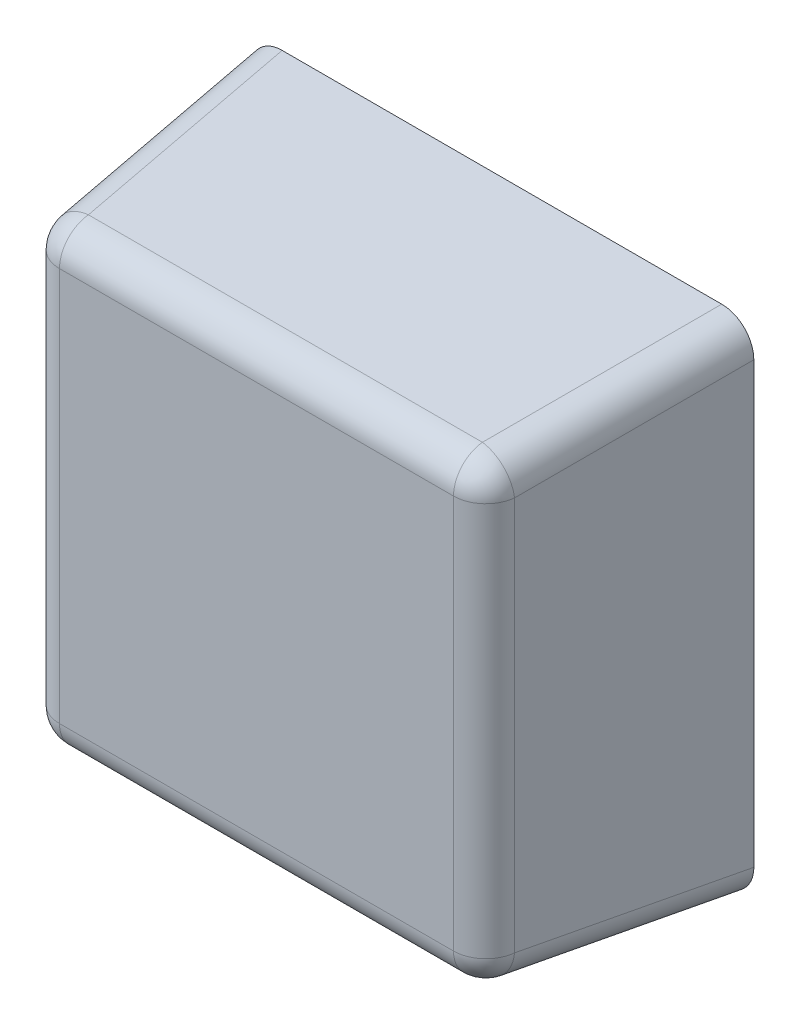
ISO-10303-21;
HEADER;
FILE_DESCRIPTION(('STEP AP214'),'2;1');
FILE_NAME('part.step','',(''),(''),'','','');
FILE_SCHEMA(('AUTOMOTIVE_DESIGN { 1 0 10303 214 1 1 1 1 }'));
ENDSEC;
DATA;
#1=APPLICATION_CONTEXT('core data for automotive mechanical design processes');
#2=APPLICATION_PROTOCOL_DEFINITION('international standard','automotive_design',2000,#1);
#3=PRODUCT_CONTEXT('',#1,'mechanical');
#4=PRODUCT('Part','Part','',(#3));
#5=PRODUCT_RELATED_PRODUCT_CATEGORY('part','',(#4));
#6=PRODUCT_DEFINITION_FORMATION('','',#4);
#7=PRODUCT_DEFINITION_CONTEXT('part definition',#1,'design');
#8=PRODUCT_DEFINITION('design','',#6,#7);
#9=PRODUCT_DEFINITION_SHAPE('','',#8);
#10=(LENGTH_UNIT() NAMED_UNIT(*) SI_UNIT(.MILLI.,.METRE.));
#11=(NAMED_UNIT(*) PLANE_ANGLE_UNIT() SI_UNIT($,.RADIAN.));
#12=(NAMED_UNIT(*) SI_UNIT($,.STERADIAN.) SOLID_ANGLE_UNIT());
#13=UNCERTAINTY_MEASURE_WITH_UNIT(LENGTH_MEASURE(1.E-05),#10,'distance_accuracy_value','');
#14=(GEOMETRIC_REPRESENTATION_CONTEXT(3) GLOBAL_UNCERTAINTY_ASSIGNED_CONTEXT((#13)) GLOBAL_UNIT_ASSIGNED_CONTEXT((#10,
#11,#12)) REPRESENTATION_CONTEXT('',''));
#15=CARTESIAN_POINT('',(0.,0.,0.));
#16=DIRECTION('',(0.,0.,1.));
#17=DIRECTION('',(1.,0.,0.));
#18=AXIS2_PLACEMENT_3D('',#15,#16,#17);
#19=CARTESIAN_POINT('',(0.,0.,0.));
#20=DIRECTION('',(-0.994521895368273,0.,0.104528463267653));
#21=DIRECTION('',(0.104528463267653,0.,0.994521895368273));
#22=AXIS2_PLACEMENT_3D('',#19,#20,#21);
#23=PLANE('',#22);
#24=DIRECTION('',(0.,-1.,0.));
#25=VECTOR('',#24,1.);
#26=CARTESIAN_POINT('',(0.,0.,0.));
#27=LINE('',#26,#25);
#28=CARTESIAN_POINT('',(0.,-1.26304280711771,0.));
#29=VERTEX_POINT('',#28);
#30=CARTESIAN_POINT('',(0.,-18.5489571928823,0.));
#31=VERTEX_POINT('',#30);
#32=EDGE_CURVE('E198',#29,#31,#27,.T.);
#33=ORIENTED_EDGE('',*,*,#32,.T.);
#34=DIRECTION('',(0.103962051184498,0.103962051184498,0.989132844377854));
#35=VECTOR('',#34,1.);
#36=CARTESIAN_POINT('',(0.200479134232315,-18.34847805865,1.90743154855324));
#37=LINE('',#36,#35);
#38=CARTESIAN_POINT('',(0.894936407924861,-17.6540207849574,8.51475114834992));
#39=VERTEX_POINT('',#38);
#40=EDGE_CURVE('E50',#31,#39,#37,.T.);
#41=ORIENTED_EDGE('',*,*,#40,.T.);
#42=DIRECTION('',(0.,-1.,0.));
#43=VECTOR('',#42,1.);
#44=CARTESIAN_POINT('',(0.894936407924859,-1.01446607878431,8.51475114834992));
#45=LINE('',#44,#43);
#46=CARTESIAN_POINT('',(0.894936407924859,-2.15797921504257,8.51475114834992));
#47=VERTEX_POINT('',#46);
#48=EDGE_CURVE('E55',#39,#47,#45,.F.);
#49=ORIENTED_EDGE('',*,*,#48,.T.);
#50=DIRECTION('',(0.103962051184498,-0.103962051184498,0.989132844377854));
#51=VECTOR('',#50,1.);
#52=CARTESIAN_POINT('',(-0.0136511031771894,-1.24939170394052,-0.129881570829977));
#53=LINE('',#52,#51);
#54=EDGE_CURVE('E167',#47,#29,#53,.F.);
#55=ORIENTED_EDGE('',*,*,#54,.T.);
#56=EDGE_LOOP('',(#33,#41,#49,#55));
#57=FACE_BOUND('',#56,.T.);
#58=ADVANCED_FACE('F33',(#57),#23,.T.);
#59=CARTESIAN_POINT('',(0.,-19.812,0.));
#60=DIRECTION('',(0.,-0.994521895368273,0.104528463267653));
#61=DIRECTION('',(0.,-0.104528463267653,-0.994521895368273));
#62=AXIS2_PLACEMENT_3D('',#59,#60,#61);
#63=PLANE('',#62);
#64=DIRECTION('',(1.,0.,0.));
#65=VECTOR('',#64,1.);
#66=CARTESIAN_POINT('',(0.,-19.812,0.));
#67=LINE('',#66,#65);
#68=CARTESIAN_POINT('',(1.26304280711771,-19.812,0.));
#69=VERTEX_POINT('',#68);
#70=CARTESIAN_POINT('',(18.5489571928823,-19.812,0.));
#71=VERTEX_POINT('',#70);
#72=EDGE_CURVE('E200',#69,#71,#67,.T.);
#73=ORIENTED_EDGE('',*,*,#72,.T.);
#74=DIRECTION('',(-0.103962051184498,0.103962051184498,0.989132844377854));
#75=VECTOR('',#74,1.);
#76=CARTESIAN_POINT('',(18.34847805865,-19.6115208657677,1.90743154855324));
#77=LINE('',#76,#75);
#78=CARTESIAN_POINT('',(17.6540207849574,-18.9170635920751,8.51475114834992));
#79=VERTEX_POINT('',#78);
#80=EDGE_CURVE('E165',#71,#79,#77,.T.);
#81=ORIENTED_EDGE('',*,*,#80,.T.);
#82=DIRECTION('',(1.,0.,0.));
#83=VECTOR('',#82,1.);
#84=CARTESIAN_POINT('',(1.01446607878431,-18.9170635920751,8.51475114834992));
#85=LINE('',#84,#83);
#86=CARTESIAN_POINT('',(2.15797921504257,-18.9170635920751,8.51475114834992));
#87=VERTEX_POINT('',#86);
#88=EDGE_CURVE('E163',#79,#87,#85,.F.);
#89=ORIENTED_EDGE('',*,*,#88,.T.);
#90=DIRECTION('',(0.103962051184498,0.103962051184498,0.989132844377854));
#91=VECTOR('',#90,1.);
#92=CARTESIAN_POINT('',(1.24939170394052,-19.8256511031772,-0.129881570829977));
#93=LINE('',#92,#91);
#94=EDGE_CURVE('E161',#87,#69,#93,.F.);
#95=ORIENTED_EDGE('',*,*,#94,.T.);
#96=EDGE_LOOP('',(#73,#81,#89,#95));
#97=FACE_BOUND('',#96,.T.);
#98=ADVANCED_FACE('F253',(#97),#63,.T.);
#99=CARTESIAN_POINT('',(19.812,0.,0.));
#100=DIRECTION('',(0.994521895368273,0.,0.104528463267653));
#101=DIRECTION('',(0.104528463267653,0.,-0.994521895368273));
#102=AXIS2_PLACEMENT_3D('',#99,#100,#101);
#103=PLANE('',#102);
#104=DIRECTION('',(0.,1.,0.));
#105=VECTOR('',#104,1.);
#106=CARTESIAN_POINT('',(18.9170635920751,-18.7975339212157,8.51475114834992));
#107=LINE('',#106,#105);
#108=CARTESIAN_POINT('',(18.9170635920751,-2.15797921504257,8.51475114834992));
#109=VERTEX_POINT('',#108);
#110=CARTESIAN_POINT('',(18.9170635920751,-17.6540207849574,8.51475114834992));
#111=VERTEX_POINT('',#110);
#112=EDGE_CURVE('E157',#109,#111,#107,.F.);
#113=ORIENTED_EDGE('',*,*,#112,.T.);
#114=DIRECTION('',(-0.103962051184498,0.103962051184498,0.989132844377854));
#115=VECTOR('',#114,1.);
#116=CARTESIAN_POINT('',(19.6115208657677,-18.34847805865,1.90743154855324));
#117=LINE('',#116,#115);
#118=CARTESIAN_POINT('',(19.812,-18.5489571928823,0.));
#119=VERTEX_POINT('',#118);
#120=EDGE_CURVE('E159',#111,#119,#117,.F.);
#121=ORIENTED_EDGE('',*,*,#120,.T.);
#122=DIRECTION('',(0.,1.,0.));
#123=VECTOR('',#122,1.);
#124=CARTESIAN_POINT('',(19.812,0.,0.));
#125=LINE('',#124,#123);
#126=CARTESIAN_POINT('',(19.812,-1.26304280711771,0.));
#127=VERTEX_POINT('',#126);
#128=EDGE_CURVE('E204',#119,#127,#125,.T.);
#129=ORIENTED_EDGE('',*,*,#128,.T.);
#130=DIRECTION('',(-0.103962051184498,-0.103962051184498,0.989132844377854));
#131=VECTOR('',#130,1.);
#132=CARTESIAN_POINT('',(19.8256511031772,-1.24939170394052,-0.129881570829977));
#133=LINE('',#132,#131);
#134=EDGE_CURVE('E155',#127,#109,#133,.T.);
#135=ORIENTED_EDGE('',*,*,#134,.T.);
#136=EDGE_LOOP('',(#113,#121,#129,#135));
#137=FACE_BOUND('',#136,.T.);
#138=ADVANCED_FACE('F258',(#137),#103,.T.);
#139=CARTESIAN_POINT('',(0.,0.,0.));
#140=DIRECTION('',(0.,0.994521895368273,0.104528463267653));
#141=DIRECTION('',(0.,-0.104528463267653,0.994521895368273));
#142=AXIS2_PLACEMENT_3D('',#139,#140,#141);
#143=PLANE('',#142);
#144=DIRECTION('',(-1.,0.,0.));
#145=VECTOR('',#144,1.);
#146=CARTESIAN_POINT('',(0.,0.,0.));
#147=LINE('',#146,#145);
#148=CARTESIAN_POINT('',(18.5489571928823,0.,0.));
#149=VERTEX_POINT('',#148);
#150=CARTESIAN_POINT('',(1.26304280711771,0.,0.));
#151=VERTEX_POINT('',#150);
#152=EDGE_CURVE('E140',#149,#151,#147,.T.);
#153=ORIENTED_EDGE('',*,*,#152,.T.);
#154=DIRECTION('',(0.103962051184498,-0.103962051184498,0.989132844377854));
#155=VECTOR('',#154,1.);
#156=CARTESIAN_POINT('',(1.24939170394052,0.0136511031771896,-0.129881570829977));
#157=LINE('',#156,#155);
#158=CARTESIAN_POINT('',(2.15797921504257,-0.894936407924859,8.51475114834992));
#159=VERTEX_POINT('',#158);
#160=EDGE_CURVE('E153',#151,#159,#157,.T.);
#161=ORIENTED_EDGE('',*,*,#160,.T.);
#162=DIRECTION('',(-1.,0.,0.));
#163=VECTOR('',#162,1.);
#164=CARTESIAN_POINT('',(18.7975339212157,-0.894936407924859,8.51475114834992));
#165=LINE('',#164,#163);
#166=CARTESIAN_POINT('',(17.6540207849574,-0.894936407924859,8.51475114834992));
#167=VERTEX_POINT('',#166);
#168=EDGE_CURVE('E118',#159,#167,#165,.F.);
#169=ORIENTED_EDGE('',*,*,#168,.T.);
#170=DIRECTION('',(-0.103962051184498,-0.103962051184498,0.989132844377854));
#171=VECTOR('',#170,1.);
#172=CARTESIAN_POINT('',(18.34847805865,-0.200479134232313,1.90743154855324));
#173=LINE('',#172,#171);
#174=EDGE_CURVE('E146',#167,#149,#173,.F.);
#175=ORIENTED_EDGE('',*,*,#174,.T.);
#176=EDGE_LOOP('',(#153,#161,#169,#175));
#177=FACE_BOUND('',#176,.T.);
#178=ADVANCED_FACE('F229',(#177),#143,.T.);
#179=CARTESIAN_POINT('',(0.,0.,9.652));
#180=DIRECTION('',(0.,0.,1.));
#181=DIRECTION('',(1.,0.,0.));
#182=AXIS2_PLACEMENT_3D('',#179,#180,#181);
#183=PLANE('',#182);
#184=DIRECTION('',(0.,-1.,0.));
#185=VECTOR('',#184,1.);
#186=CARTESIAN_POINT('',(17.6540207849574,-1.01446607878431,9.652));
#187=LINE('',#186,#185);
#188=CARTESIAN_POINT('',(17.6540207849574,-17.6540207849574,9.652));
#189=VERTEX_POINT('',#188);
#190=CARTESIAN_POINT('',(17.6540207849574,-2.15797921504257,9.652));
#191=VERTEX_POINT('',#190);
#192=EDGE_CURVE('E144',#189,#191,#187,.F.);
#193=ORIENTED_EDGE('',*,*,#192,.T.);
#194=DIRECTION('',(1.,0.,0.));
#195=VECTOR('',#194,1.);
#196=CARTESIAN_POINT('',(1.01446607878431,-2.15797921504257,9.652));
#197=LINE('',#196,#195);
#198=CARTESIAN_POINT('',(2.15797921504257,-2.15797921504257,9.652));
#199=VERTEX_POINT('',#198);
#200=EDGE_CURVE('E116',#191,#199,#197,.F.);
#201=ORIENTED_EDGE('',*,*,#200,.T.);
#202=DIRECTION('',(0.,1.,0.));
#203=VECTOR('',#202,1.);
#204=CARTESIAN_POINT('',(2.15797921504257,-18.7975339212157,9.652));
#205=LINE('',#204,#203);
#206=CARTESIAN_POINT('',(2.15797921504257,-17.6540207849574,9.652));
#207=VERTEX_POINT('',#206);
#208=EDGE_CURVE('E133',#199,#207,#205,.F.);
#209=ORIENTED_EDGE('',*,*,#208,.T.);
#210=DIRECTION('',(-1.,0.,0.));
#211=VECTOR('',#210,1.);
#212=CARTESIAN_POINT('',(18.7975339212157,-17.6540207849574,9.652));
#213=LINE('',#212,#211);
#214=EDGE_CURVE('E139',#207,#189,#213,.F.);
#215=ORIENTED_EDGE('',*,*,#214,.T.);
#216=EDGE_LOOP('',(#193,#201,#209,#215));
#217=FACE_BOUND('',#216,.T.);
#218=ADVANCED_FACE('F142',(#217),#183,.T.);
#219=CARTESIAN_POINT('',(0.,0.,0.));
#220=DIRECTION('',(0.,0.,1.));
#221=DIRECTION('',(1.,0.,0.));
#222=AXIS2_PLACEMENT_3D('',#219,#220,#221);
#223=PLANE('',#222);
#224=ORIENTED_EDGE('',*,*,#128,.F.);
#225=CARTESIAN_POINT('',(18.5350044849543,-18.5350044849543,0.));
#226=DIRECTION('',(0.,0.,1.));
#227=DIRECTION('',(0.707106781186548,-0.707106781186548,0.));
#228=AXIS2_PLACEMENT_3D('',#225,#226,#227);
#229=ELLIPSE('',#228,1.28395291615132,1.27);
#230=EDGE_CURVE('E11',#119,#71,#229,.F.);
#231=ORIENTED_EDGE('',*,*,#230,.T.);
#232=ORIENTED_EDGE('',*,*,#72,.F.);
#233=CARTESIAN_POINT('',(1.27699551504567,-18.5350044849543,0.));
#234=DIRECTION('',(0.,0.,1.));
#235=DIRECTION('',(-0.707106781186547,-0.707106781186548,0.));
#236=AXIS2_PLACEMENT_3D('',#233,#234,#235);
#237=ELLIPSE('',#236,1.28395291615132,1.27);
#238=EDGE_CURVE('E42',#69,#31,#237,.F.);
#239=ORIENTED_EDGE('',*,*,#238,.T.);
#240=ORIENTED_EDGE('',*,*,#32,.F.);
#241=CARTESIAN_POINT('',(1.27699551504567,-1.27699551504567,0.));
#242=DIRECTION('',(0.,0.,1.));
#243=DIRECTION('',(-0.707106781186548,0.707106781186547,0.));
#244=AXIS2_PLACEMENT_3D('',#241,#242,#243);
#245=ELLIPSE('',#244,1.28395291615132,1.27);
#246=EDGE_CURVE('E173',#29,#151,#245,.F.);
#247=ORIENTED_EDGE('',*,*,#246,.T.);
#248=ORIENTED_EDGE('',*,*,#152,.F.);
#249=CARTESIAN_POINT('',(18.5350044849543,-1.27699551504567,0.));
#250=DIRECTION('',(0.,0.,1.));
#251=DIRECTION('',(0.707106781186548,0.707106781186548,0.));
#252=AXIS2_PLACEMENT_3D('',#249,#250,#251);
#253=ELLIPSE('',#252,1.28395291615132,1.27);
#254=EDGE_CURVE('E171',#149,#127,#253,.F.);
#255=ORIENTED_EDGE('',*,*,#254,.T.);
#256=EDGE_LOOP('',(#224,#231,#232,#239,#240,#247,#248,#255));
#257=FACE_BOUND('',#256,.T.);
#258=ADVANCED_FACE('F236',(#257),#223,.F.);
#259=CARTESIAN_POINT('',(18.34847805865,-18.34847805865,1.77468040020332));
#260=DIRECTION('',(0.103962051184498,-0.103962051184498,-0.989132844377854));
#261=DIRECTION('',(-0.994521895368273,0.,-0.104528463267653));
#262=AXIS2_PLACEMENT_3D('',#259,#260,#261);
#263=CYLINDRICAL_SURFACE('',#262,1.27);
#264=ORIENTED_EDGE('',*,*,#230,.F.);
#265=ORIENTED_EDGE('',*,*,#120,.F.);
#266=CARTESIAN_POINT('',(17.6540207849574,-17.6540207849574,8.382));
#267=DIRECTION('',(-0.103962051184498,0.103962051184497,0.989132844377854));
#268=DIRECTION('',(0.994521895368273,0.,0.104528463267653));
#269=AXIS2_PLACEMENT_3D('',#266,#267,#268);
#270=CIRCLE('',#269,1.27);
#271=EDGE_CURVE('E37',#79,#111,#270,.T.);
#272=ORIENTED_EDGE('',*,*,#271,.F.);
#273=ORIENTED_EDGE('',*,*,#80,.F.);
#274=EDGE_LOOP('',(#264,#265,#272,#273));
#275=FACE_BOUND('',#274,.T.);
#276=ADVANCED_FACE('F35',(#275),#263,.T.);
#277=CARTESIAN_POINT('',(0.,-17.6540207849574,8.382));
#278=DIRECTION('',(1.,0.,0.));
#279=DIRECTION('',(0.,0.,-1.));
#280=AXIS2_PLACEMENT_3D('',#277,#278,#279);
#281=CYLINDRICAL_SURFACE('',#280,1.27);
#282=CARTESIAN_POINT('',(2.15797921504257,-17.6540207849574,8.382));
#283=DIRECTION('',(-1.,0.,0.));
#284=DIRECTION('',(0.,0.,1.));
#285=AXIS2_PLACEMENT_3D('',#282,#283,#284);
#286=CIRCLE('',#285,1.27);
#287=EDGE_CURVE('E190',#87,#207,#286,.T.);
#288=ORIENTED_EDGE('',*,*,#287,.F.);
#289=ORIENTED_EDGE('',*,*,#88,.F.);
#290=CARTESIAN_POINT('',(17.6540207849574,-17.6540207849574,8.382));
#291=DIRECTION('',(1.,0.,0.));
#292=DIRECTION('',(0.,1.,0.));
#293=AXIS2_PLACEMENT_3D('',#290,#291,#292);
#294=CIRCLE('',#293,1.27);
#295=EDGE_CURVE('E192',#189,#79,#294,.T.);
#296=ORIENTED_EDGE('',*,*,#295,.F.);
#297=ORIENTED_EDGE('',*,*,#214,.F.);
#298=EDGE_LOOP('',(#288,#289,#296,#297));
#299=FACE_BOUND('',#298,.T.);
#300=ADVANCED_FACE('F213',(#299),#281,.T.);
#301=CARTESIAN_POINT('',(1.24939170394052,-18.5626082960595,-0.262632719179897));
#302=DIRECTION('',(-0.103962051184498,-0.103962051184498,-0.989132844377854));
#303=DIRECTION('',(0.,0.994521895368273,-0.104528463267653));
#304=AXIS2_PLACEMENT_3D('',#301,#302,#303);
#305=CYLINDRICAL_SURFACE('',#304,1.27);
#306=ORIENTED_EDGE('',*,*,#238,.F.);
#307=ORIENTED_EDGE('',*,*,#94,.F.);
#308=CARTESIAN_POINT('',(2.15797921504257,-17.6540207849574,8.382));
#309=DIRECTION('',(0.103962051184497,0.103962051184499,0.989132844377854));
#310=DIRECTION('',(0.,-0.994521895368273,0.104528463267655));
#311=AXIS2_PLACEMENT_3D('',#308,#309,#310);
#312=CIRCLE('',#311,1.27);
#313=EDGE_CURVE('E187',#39,#87,#312,.T.);
#314=ORIENTED_EDGE('',*,*,#313,.F.);
#315=ORIENTED_EDGE('',*,*,#40,.F.);
#316=EDGE_LOOP('',(#306,#307,#314,#315));
#317=FACE_BOUND('',#316,.T.);
#318=ADVANCED_FACE('F241',(#317),#305,.T.);
#319=CARTESIAN_POINT('',(17.6540207849574,-17.6540207849574,8.382));
#320=DIRECTION('',(0.,0.,1.));
#321=DIRECTION('',(1.,0.,0.));
#322=AXIS2_PLACEMENT_3D('',#319,#320,#321);
#323=SPHERICAL_SURFACE('',#322,1.27);
#324=ORIENTED_EDGE('',*,*,#295,.T.);
#325=ORIENTED_EDGE('',*,*,#271,.T.);
#326=CARTESIAN_POINT('',(17.6540207849574,-17.6540207849574,8.382));
#327=DIRECTION('',(0.,-1.,0.));
#328=DIRECTION('',(0.,0.,-1.));
#329=AXIS2_PLACEMENT_3D('',#326,#327,#328);
#330=CIRCLE('',#329,1.27);
#331=EDGE_CURVE('E184',#189,#111,#330,.F.);
#332=ORIENTED_EDGE('',*,*,#331,.F.);
#333=EDGE_LOOP('',(#324,#325,#332));
#334=FACE_BOUND('',#333,.T.);
#335=ADVANCED_FACE('F214',(#334),#323,.T.);
#336=CARTESIAN_POINT('',(2.15797921504257,-17.6540207849574,8.382));
#337=DIRECTION('',(0.,0.,1.));
#338=DIRECTION('',(0.,-1.,0.));
#339=AXIS2_PLACEMENT_3D('',#336,#337,#338);
#340=SPHERICAL_SURFACE('',#339,1.27);
#341=ORIENTED_EDGE('',*,*,#313,.T.);
#342=ORIENTED_EDGE('',*,*,#287,.T.);
#343=CARTESIAN_POINT('',(2.15797921504257,-17.6540207849574,8.382));
#344=DIRECTION('',(0.,-1.,0.));
#345=DIRECTION('',(1.,0.,0.));
#346=AXIS2_PLACEMENT_3D('',#343,#344,#345);
#347=CIRCLE('',#346,1.27);
#348=EDGE_CURVE('E136',#39,#207,#347,.F.);
#349=ORIENTED_EDGE('',*,*,#348,.F.);
#350=EDGE_LOOP('',(#341,#342,#349));
#351=FACE_BOUND('',#350,.T.);
#352=ADVANCED_FACE('F243',(#351),#340,.T.);
#353=CARTESIAN_POINT('',(18.34847805865,-1.46352194135002,1.77468040020332));
#354=DIRECTION('',(0.103962051184498,0.103962051184498,-0.989132844377854));
#355=DIRECTION('',(-0.994521895368273,0.,-0.104528463267653));
#356=AXIS2_PLACEMENT_3D('',#353,#354,#355);
#357=CYLINDRICAL_SURFACE('',#356,1.27);
#358=ORIENTED_EDGE('',*,*,#254,.F.);
#359=ORIENTED_EDGE('',*,*,#174,.F.);
#360=CARTESIAN_POINT('',(17.6540207849574,-2.15797921504257,8.382));
#361=DIRECTION('',(-0.103962051184497,-0.103962051184496,0.989132844377854));
#362=DIRECTION('',(0.994521895368273,0.,0.104528463267653));
#363=AXIS2_PLACEMENT_3D('',#360,#361,#362);
#364=CIRCLE('',#363,1.27);
#365=EDGE_CURVE('E180',#109,#167,#364,.T.);
#366=ORIENTED_EDGE('',*,*,#365,.F.);
#367=ORIENTED_EDGE('',*,*,#134,.F.);
#368=EDGE_LOOP('',(#358,#359,#366,#367));
#369=FACE_BOUND('',#368,.T.);
#370=ADVANCED_FACE('F226',(#369),#357,.T.);
#371=CARTESIAN_POINT('',(17.6540207849574,0.,8.382));
#372=DIRECTION('',(0.,1.,0.));
#373=DIRECTION('',(0.,0.,1.));
#374=AXIS2_PLACEMENT_3D('',#371,#372,#373);
#375=CYLINDRICAL_SURFACE('',#374,1.27);
#376=ORIENTED_EDGE('',*,*,#331,.T.);
#377=ORIENTED_EDGE('',*,*,#112,.F.);
#378=CARTESIAN_POINT('',(17.6540207849574,-2.15797921504257,8.382));
#379=DIRECTION('',(0.,1.,0.));
#380=DIRECTION('',(0.,0.,1.));
#381=AXIS2_PLACEMENT_3D('',#378,#379,#380);
#382=CIRCLE('',#381,1.27);
#383=EDGE_CURVE('E130',#191,#109,#382,.T.);
#384=ORIENTED_EDGE('',*,*,#383,.F.);
#385=ORIENTED_EDGE('',*,*,#192,.F.);
#386=EDGE_LOOP('',(#376,#377,#384,#385));
#387=FACE_BOUND('',#386,.T.);
#388=ADVANCED_FACE('F217',(#387),#375,.T.);
#389=CARTESIAN_POINT('',(2.15797921504257,0.,8.382));
#390=DIRECTION('',(0.,-1.,0.));
#391=DIRECTION('',(1.,0.,0.));
#392=AXIS2_PLACEMENT_3D('',#389,#390,#391);
#393=CYLINDRICAL_SURFACE('',#392,1.27);
#394=ORIENTED_EDGE('',*,*,#348,.T.);
#395=ORIENTED_EDGE('',*,*,#208,.F.);
#396=CARTESIAN_POINT('',(2.15797921504257,-2.15797921504257,8.382));
#397=DIRECTION('',(0.,1.,0.));
#398=DIRECTION('',(0.,0.,1.));
#399=AXIS2_PLACEMENT_3D('',#396,#397,#398);
#400=CIRCLE('',#399,1.27);
#401=EDGE_CURVE('E124',#47,#199,#400,.T.);
#402=ORIENTED_EDGE('',*,*,#401,.F.);
#403=ORIENTED_EDGE('',*,*,#48,.F.);
#404=EDGE_LOOP('',(#394,#395,#402,#403));
#405=FACE_BOUND('',#404,.T.);
#406=ADVANCED_FACE('F134',(#405),#393,.T.);
#407=CARTESIAN_POINT('',(1.24939170394052,-1.24939170394052,-0.262632719179897));
#408=DIRECTION('',(-0.103962051184498,0.103962051184498,-0.989132844377854));
#409=DIRECTION('',(-0.994521895368273,0.,0.104528463267653));
#410=AXIS2_PLACEMENT_3D('',#407,#408,#409);
#411=CYLINDRICAL_SURFACE('',#410,1.27);
#412=ORIENTED_EDGE('',*,*,#246,.F.);
#413=ORIENTED_EDGE('',*,*,#54,.F.);
#414=CARTESIAN_POINT('',(2.15797921504257,-2.15797921504257,8.382));
#415=DIRECTION('',(0.103962051184497,-0.103962051184497,0.989132844377854));
#416=DIRECTION('',(0.,-0.994521895368274,-0.104528463267653));
#417=AXIS2_PLACEMENT_3D('',#414,#415,#416);
#418=CIRCLE('',#417,1.27);
#419=EDGE_CURVE('E128',#159,#47,#418,.T.);
#420=ORIENTED_EDGE('',*,*,#419,.F.);
#421=ORIENTED_EDGE('',*,*,#160,.F.);
#422=EDGE_LOOP('',(#412,#413,#420,#421));
#423=FACE_BOUND('',#422,.T.);
#424=ADVANCED_FACE('F233',(#423),#411,.T.);
#425=CARTESIAN_POINT('',(17.6540207849574,-2.15797921504257,8.382));
#426=DIRECTION('',(0.,0.,1.));
#427=DIRECTION('',(1.,0.,0.));
#428=AXIS2_PLACEMENT_3D('',#425,#426,#427);
#429=SPHERICAL_SURFACE('',#428,1.27);
#430=ORIENTED_EDGE('',*,*,#383,.T.);
#431=ORIENTED_EDGE('',*,*,#365,.T.);
#432=CARTESIAN_POINT('',(17.6540207849574,-2.15797921504257,8.382));
#433=DIRECTION('',(1.,0.,0.));
#434=DIRECTION('',(0.,0.,-1.));
#435=AXIS2_PLACEMENT_3D('',#432,#433,#434);
#436=CIRCLE('',#435,1.27);
#437=EDGE_CURVE('E121',#191,#167,#436,.F.);
#438=ORIENTED_EDGE('',*,*,#437,.F.);
#439=EDGE_LOOP('',(#430,#431,#438));
#440=FACE_BOUND('',#439,.T.);
#441=ADVANCED_FACE('F221',(#440),#429,.T.);
#442=CARTESIAN_POINT('',(2.15797921504257,-2.15797921504257,8.382));
#443=DIRECTION('',(0.,0.,1.));
#444=DIRECTION('',(1.,0.,0.));
#445=AXIS2_PLACEMENT_3D('',#442,#443,#444);
#446=SPHERICAL_SURFACE('',#445,1.27);
#447=ORIENTED_EDGE('',*,*,#419,.T.);
#448=ORIENTED_EDGE('',*,*,#401,.T.);
#449=CARTESIAN_POINT('',(2.15797921504257,-2.15797921504257,8.382));
#450=DIRECTION('',(-1.,0.,0.));
#451=DIRECTION('',(0.,-1.,0.));
#452=AXIS2_PLACEMENT_3D('',#449,#450,#451);
#453=CIRCLE('',#452,1.27);
#454=EDGE_CURVE('E112',#159,#199,#453,.F.);
#455=ORIENTED_EDGE('',*,*,#454,.F.);
#456=EDGE_LOOP('',(#447,#448,#455));
#457=FACE_BOUND('',#456,.T.);
#458=ADVANCED_FACE('F126',(#457),#446,.T.);
#459=CARTESIAN_POINT('',(0.,-2.15797921504257,8.382));
#460=DIRECTION('',(-1.,0.,0.));
#461=DIRECTION('',(0.,0.,1.));
#462=AXIS2_PLACEMENT_3D('',#459,#460,#461);
#463=CYLINDRICAL_SURFACE('',#462,1.27);
#464=ORIENTED_EDGE('',*,*,#437,.T.);
#465=ORIENTED_EDGE('',*,*,#168,.F.);
#466=ORIENTED_EDGE('',*,*,#454,.T.);
#467=ORIENTED_EDGE('',*,*,#200,.F.);
#468=EDGE_LOOP('',(#464,#465,#466,#467));
#469=FACE_BOUND('',#468,.T.);
#470=ADVANCED_FACE('F114',(#469),#463,.T.);
#471=CLOSED_SHELL('',(#58,#98,#138,#178,#218,#258,#276,#300,#318,#335,#352,#370,#388,#406,#424,
#441,#458,#470));
#472=MANIFOLD_SOLID_BREP('B2',#471);
#473=ADVANCED_BREP_SHAPE_REPRESENTATION('',(#18,#472),#14);
#474=SHAPE_DEFINITION_REPRESENTATION(#9,#473);
ENDSEC;
END-ISO-10303-21;
